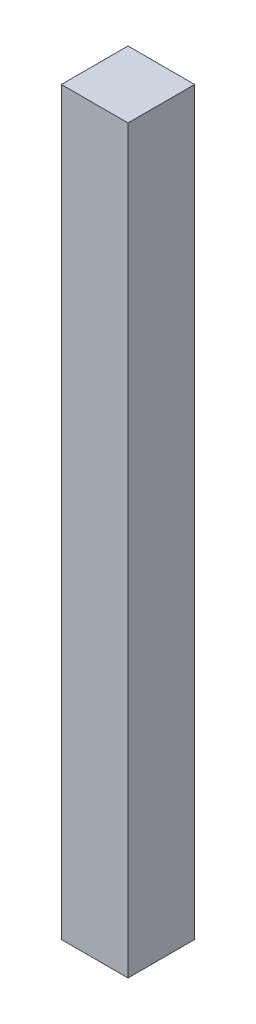
ISO-10303-21;
HEADER;
FILE_DESCRIPTION(('STEP AP214'),'2;1');
FILE_NAME('part.step','',(''),(''),'','','');
FILE_SCHEMA(('AUTOMOTIVE_DESIGN { 1 0 10303 214 1 1 1 1 }'));
ENDSEC;
DATA;
#1=APPLICATION_CONTEXT('core data for automotive mechanical design processes');
#2=APPLICATION_PROTOCOL_DEFINITION('international standard','automotive_design',2000,#1);
#3=PRODUCT_CONTEXT('',#1,'mechanical');
#4=PRODUCT('Part','Part','',(#3));
#5=PRODUCT_RELATED_PRODUCT_CATEGORY('part','',(#4));
#6=PRODUCT_DEFINITION_FORMATION('','',#4);
#7=PRODUCT_DEFINITION_CONTEXT('part definition',#1,'design');
#8=PRODUCT_DEFINITION('design','',#6,#7);
#9=PRODUCT_DEFINITION_SHAPE('','',#8);
#10=(LENGTH_UNIT() NAMED_UNIT(*) SI_UNIT(.MILLI.,.METRE.));
#11=(NAMED_UNIT(*) PLANE_ANGLE_UNIT() SI_UNIT($,.RADIAN.));
#12=(NAMED_UNIT(*) SI_UNIT($,.STERADIAN.) SOLID_ANGLE_UNIT());
#13=UNCERTAINTY_MEASURE_WITH_UNIT(LENGTH_MEASURE(1.E-05),#10,'distance_accuracy_value','');
#14=(GEOMETRIC_REPRESENTATION_CONTEXT(3) GLOBAL_UNCERTAINTY_ASSIGNED_CONTEXT((#13)) GLOBAL_UNIT_ASSIGNED_CONTEXT((#10,
#11,#12)) REPRESENTATION_CONTEXT('',''));
#15=CARTESIAN_POINT('',(0.,0.,0.));
#16=DIRECTION('',(0.,0.,1.));
#17=DIRECTION('',(1.,0.,0.));
#18=AXIS2_PLACEMENT_3D('',#15,#16,#17);
#19=CARTESIAN_POINT('',(45.,490.,26.));
#20=DIRECTION('',(1.,0.,0.));
#21=DIRECTION('',(0.,0.,-1.));
#22=AXIS2_PLACEMENT_3D('',#19,#20,#21);
#23=PLANE('',#22);
#24=DIRECTION('',(0.,-1.,0.));
#25=VECTOR('',#24,1.);
#26=CARTESIAN_POINT('',(45.,490.,8.));
#27=LINE('',#26,#25);
#28=CARTESIAN_POINT('',(45.,690.,8.));
#29=VERTEX_POINT('',#28);
#30=CARTESIAN_POINT('',(45.,490.,8.));
#31=VERTEX_POINT('',#30);
#32=EDGE_CURVE('E102',#29,#31,#27,.T.);
#33=ORIENTED_EDGE('',*,*,#32,.T.);
#34=DIRECTION('',(0.,0.,-1.));
#35=VECTOR('',#34,1.);
#36=CARTESIAN_POINT('',(45.,490.,26.));
#37=LINE('',#36,#35);
#38=CARTESIAN_POINT('',(45.,490.,26.));
#39=VERTEX_POINT('',#38);
#40=EDGE_CURVE('E11',#39,#31,#37,.T.);
#41=ORIENTED_EDGE('',*,*,#40,.F.);
#42=DIRECTION('',(0.,-1.,0.));
#43=VECTOR('',#42,1.);
#44=CARTESIAN_POINT('',(45.,490.,26.));
#45=LINE('',#44,#43);
#46=CARTESIAN_POINT('',(45.,690.,26.));
#47=VERTEX_POINT('',#46);
#48=EDGE_CURVE('E90',#47,#39,#45,.T.);
#49=ORIENTED_EDGE('',*,*,#48,.F.);
#50=DIRECTION('',(0.,0.,-1.));
#51=VECTOR('',#50,1.);
#52=CARTESIAN_POINT('',(45.,690.,26.));
#53=LINE('',#52,#51);
#54=EDGE_CURVE('E98',#47,#29,#53,.T.);
#55=ORIENTED_EDGE('',*,*,#54,.T.);
#56=EDGE_LOOP('',(#33,#41,#49,#55));
#57=FACE_BOUND('',#56,.T.);
#58=ADVANCED_FACE('F39',(#57),#23,.F.);
#59=CARTESIAN_POINT('',(45.,490.,26.));
#60=DIRECTION('',(0.,1.,0.));
#61=DIRECTION('',(0.,0.,1.));
#62=AXIS2_PLACEMENT_3D('',#59,#60,#61);
#63=PLANE('',#62);
#64=DIRECTION('',(1.,0.,0.));
#65=VECTOR('',#64,1.);
#66=CARTESIAN_POINT('',(45.,490.,8.));
#67=LINE('',#66,#65);
#68=CARTESIAN_POINT('',(63.,490.,8.));
#69=VERTEX_POINT('',#68);
#70=EDGE_CURVE('E94',#31,#69,#67,.T.);
#71=ORIENTED_EDGE('',*,*,#70,.T.);
#72=DIRECTION('',(0.,0.,-1.));
#73=VECTOR('',#72,1.);
#74=CARTESIAN_POINT('',(63.,490.,26.));
#75=LINE('',#74,#73);
#76=CARTESIAN_POINT('',(63.,490.,26.));
#77=VERTEX_POINT('',#76);
#78=EDGE_CURVE('E47',#77,#69,#75,.T.);
#79=ORIENTED_EDGE('',*,*,#78,.F.);
#80=DIRECTION('',(1.,0.,0.));
#81=VECTOR('',#80,1.);
#82=CARTESIAN_POINT('',(45.,490.,26.));
#83=LINE('',#82,#81);
#84=EDGE_CURVE('E85',#39,#77,#83,.T.);
#85=ORIENTED_EDGE('',*,*,#84,.F.);
#86=ORIENTED_EDGE('',*,*,#40,.T.);
#87=EDGE_LOOP('',(#71,#79,#85,#86));
#88=FACE_BOUND('',#87,.T.);
#89=ADVANCED_FACE('F93',(#88),#63,.F.);
#90=CARTESIAN_POINT('',(63.,490.,26.));
#91=DIRECTION('',(-1.,0.,0.));
#92=DIRECTION('',(0.,0.,1.));
#93=AXIS2_PLACEMENT_3D('',#90,#91,#92);
#94=PLANE('',#93);
#95=DIRECTION('',(0.,1.,0.));
#96=VECTOR('',#95,1.);
#97=CARTESIAN_POINT('',(63.,490.,8.));
#98=LINE('',#97,#96);
#99=CARTESIAN_POINT('',(63.,690.,8.));
#100=VERTEX_POINT('',#99);
#101=EDGE_CURVE('E72',#69,#100,#98,.T.);
#102=ORIENTED_EDGE('',*,*,#101,.T.);
#103=DIRECTION('',(0.,0.,-1.));
#104=VECTOR('',#103,1.);
#105=CARTESIAN_POINT('',(63.,690.,26.));
#106=LINE('',#105,#104);
#107=CARTESIAN_POINT('',(63.,690.,26.));
#108=VERTEX_POINT('',#107);
#109=EDGE_CURVE('E95',#108,#100,#106,.T.);
#110=ORIENTED_EDGE('',*,*,#109,.F.);
#111=DIRECTION('',(0.,1.,0.));
#112=VECTOR('',#111,1.);
#113=CARTESIAN_POINT('',(63.,490.,26.));
#114=LINE('',#113,#112);
#115=EDGE_CURVE('E88',#77,#108,#114,.T.);
#116=ORIENTED_EDGE('',*,*,#115,.F.);
#117=ORIENTED_EDGE('',*,*,#78,.T.);
#118=EDGE_LOOP('',(#102,#110,#116,#117));
#119=FACE_BOUND('',#118,.T.);
#120=ADVANCED_FACE('F96',(#119),#94,.F.);
#121=CARTESIAN_POINT('',(45.,690.,26.));
#122=DIRECTION('',(0.,-1.,0.));
#123=DIRECTION('',(0.,0.,-1.));
#124=AXIS2_PLACEMENT_3D('',#121,#122,#123);
#125=PLANE('',#124);
#126=DIRECTION('',(-1.,0.,0.));
#127=VECTOR('',#126,1.);
#128=CARTESIAN_POINT('',(45.,690.,8.));
#129=LINE('',#128,#127);
#130=EDGE_CURVE('E78',#100,#29,#129,.T.);
#131=ORIENTED_EDGE('',*,*,#130,.T.);
#132=ORIENTED_EDGE('',*,*,#54,.F.);
#133=DIRECTION('',(-1.,0.,0.));
#134=VECTOR('',#133,1.);
#135=CARTESIAN_POINT('',(45.,690.,26.));
#136=LINE('',#135,#134);
#137=EDGE_CURVE('E55',#108,#47,#136,.T.);
#138=ORIENTED_EDGE('',*,*,#137,.F.);
#139=ORIENTED_EDGE('',*,*,#109,.T.);
#140=EDGE_LOOP('',(#131,#132,#138,#139));
#141=FACE_BOUND('',#140,.T.);
#142=ADVANCED_FACE('F109',(#141),#125,.F.);
#143=CARTESIAN_POINT('',(0.,0.,26.));
#144=DIRECTION('',(0.,0.,-1.));
#145=DIRECTION('',(-1.,0.,0.));
#146=AXIS2_PLACEMENT_3D('',#143,#144,#145);
#147=PLANE('',#146);
#148=ORIENTED_EDGE('',*,*,#48,.T.);
#149=ORIENTED_EDGE('',*,*,#84,.T.);
#150=ORIENTED_EDGE('',*,*,#115,.T.);
#151=ORIENTED_EDGE('',*,*,#137,.T.);
#152=EDGE_LOOP('',(#148,#149,#150,#151));
#153=FACE_BOUND('',#152,.T.);
#154=ADVANCED_FACE('F86',(#153),#147,.F.);
#155=CARTESIAN_POINT('',(0.,0.,8.));
#156=DIRECTION('',(0.,0.,-1.));
#157=DIRECTION('',(-1.,0.,0.));
#158=AXIS2_PLACEMENT_3D('',#155,#156,#157);
#159=PLANE('',#158);
#160=ORIENTED_EDGE('',*,*,#32,.F.);
#161=ORIENTED_EDGE('',*,*,#130,.F.);
#162=ORIENTED_EDGE('',*,*,#101,.F.);
#163=ORIENTED_EDGE('',*,*,#70,.F.);
#164=EDGE_LOOP('',(#160,#161,#162,#163));
#165=FACE_BOUND('',#164,.T.);
#166=ADVANCED_FACE('F112',(#165),#159,.T.);
#167=CLOSED_SHELL('',(#58,#89,#120,#142,#154,#166));
#168=MANIFOLD_SOLID_BREP('B2',#167);
#169=ADVANCED_BREP_SHAPE_REPRESENTATION('',(#18,#168),#14);
#170=SHAPE_DEFINITION_REPRESENTATION(#9,#169);
ENDSEC;
END-ISO-10303-21;
